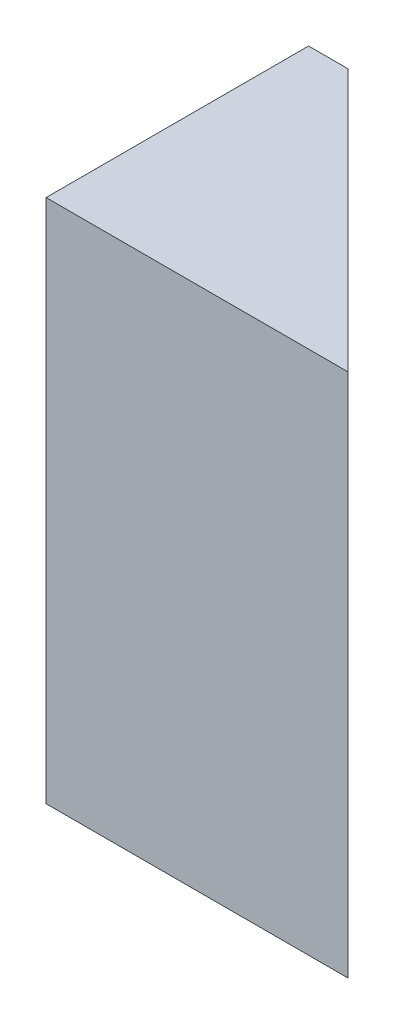
ISO-10303-21;
HEADER;
FILE_DESCRIPTION(('STEP AP214'),'2;1');
FILE_NAME('part.step','',(''),(''),'','','');
FILE_SCHEMA(('AUTOMOTIVE_DESIGN { 1 0 10303 214 1 1 1 1 }'));
ENDSEC;
DATA;
#1=APPLICATION_CONTEXT('core data for automotive mechanical design processes');
#2=APPLICATION_PROTOCOL_DEFINITION('international standard','automotive_design',2000,#1);
#3=PRODUCT_CONTEXT('',#1,'mechanical');
#4=PRODUCT('Part','Part','',(#3));
#5=PRODUCT_RELATED_PRODUCT_CATEGORY('part','',(#4));
#6=PRODUCT_DEFINITION_FORMATION('','',#4);
#7=PRODUCT_DEFINITION_CONTEXT('part definition',#1,'design');
#8=PRODUCT_DEFINITION('design','',#6,#7);
#9=PRODUCT_DEFINITION_SHAPE('','',#8);
#10=(LENGTH_UNIT() NAMED_UNIT(*) SI_UNIT(.MILLI.,.METRE.));
#11=(NAMED_UNIT(*) PLANE_ANGLE_UNIT() SI_UNIT($,.RADIAN.));
#12=(NAMED_UNIT(*) SI_UNIT($,.STERADIAN.) SOLID_ANGLE_UNIT());
#13=UNCERTAINTY_MEASURE_WITH_UNIT(LENGTH_MEASURE(1.E-05),#10,'distance_accuracy_value','');
#14=(GEOMETRIC_REPRESENTATION_CONTEXT(3) GLOBAL_UNCERTAINTY_ASSIGNED_CONTEXT((#13)) GLOBAL_UNIT_ASSIGNED_CONTEXT((#10,
#11,#12)) REPRESENTATION_CONTEXT('',''));
#15=CARTESIAN_POINT('',(0.,0.,0.));
#16=DIRECTION('',(0.,0.,1.));
#17=DIRECTION('',(1.,0.,0.));
#18=AXIS2_PLACEMENT_3D('',#15,#16,#17);
#19=CARTESIAN_POINT('',(0.,80.,0.));
#20=DIRECTION('',(0.,0.,-1.));
#21=DIRECTION('',(-1.,0.,0.));
#22=AXIS2_PLACEMENT_3D('',#19,#20,#21);
#23=PLANE('',#22);
#24=DIRECTION('',(1.,0.,0.));
#25=VECTOR('',#24,1.);
#26=CARTESIAN_POINT('',(0.,0.,0.));
#27=LINE('',#26,#25);
#28=CARTESIAN_POINT('',(-6.,0.,0.));
#29=VERTEX_POINT('',#28);
#30=CARTESIAN_POINT('',(40.,0.,0.));
#31=VERTEX_POINT('',#30);
#32=EDGE_CURVE('E79',#29,#31,#27,.T.);
#33=ORIENTED_EDGE('',*,*,#32,.T.);
#34=DIRECTION('',(0.,-1.,0.));
#35=VECTOR('',#34,1.);
#36=CARTESIAN_POINT('',(40.,80.,0.));
#37=LINE('',#36,#35);
#38=CARTESIAN_POINT('',(40.,80.,0.));
#39=VERTEX_POINT('',#38);
#40=EDGE_CURVE('E11',#39,#31,#37,.T.);
#41=ORIENTED_EDGE('',*,*,#40,.F.);
#42=DIRECTION('',(1.,0.,0.));
#43=VECTOR('',#42,1.);
#44=CARTESIAN_POINT('',(0.,80.,0.));
#45=LINE('',#44,#43);
#46=CARTESIAN_POINT('',(-6.,80.,0.));
#47=VERTEX_POINT('',#46);
#48=EDGE_CURVE('E84',#47,#39,#45,.T.);
#49=ORIENTED_EDGE('',*,*,#48,.F.);
#50=DIRECTION('',(0.,-1.,0.));
#51=VECTOR('',#50,1.);
#52=CARTESIAN_POINT('',(-6.,80.,0.));
#53=LINE('',#52,#51);
#54=EDGE_CURVE('E99',#47,#29,#53,.T.);
#55=ORIENTED_EDGE('',*,*,#54,.T.);
#56=EDGE_LOOP('',(#33,#41,#49,#55));
#57=FACE_BOUND('',#56,.T.);
#58=ADVANCED_FACE('F39',(#57),#23,.F.);
#59=CARTESIAN_POINT('',(0.,80.,-40.));
#60=DIRECTION('',(-0.707106781186548,0.,0.707106781186548));
#61=DIRECTION('',(0.707106781186548,0.,0.707106781186548));
#62=AXIS2_PLACEMENT_3D('',#59,#60,#61);
#63=PLANE('',#62);
#64=DIRECTION('',(-0.707106781186548,0.,-0.707106781186548));
#65=VECTOR('',#64,1.);
#66=CARTESIAN_POINT('',(0.,0.,-40.));
#67=LINE('',#66,#65);
#68=CARTESIAN_POINT('',(0.,0.,-40.));
#69=VERTEX_POINT('',#68);
#70=EDGE_CURVE('E95',#31,#69,#67,.T.);
#71=ORIENTED_EDGE('',*,*,#70,.T.);
#72=DIRECTION('',(0.,-1.,0.));
#73=VECTOR('',#72,1.);
#74=CARTESIAN_POINT('',(0.,80.,-40.));
#75=LINE('',#74,#73);
#76=CARTESIAN_POINT('',(0.,80.,-40.));
#77=VERTEX_POINT('',#76);
#78=EDGE_CURVE('E47',#77,#69,#75,.T.);
#79=ORIENTED_EDGE('',*,*,#78,.F.);
#80=DIRECTION('',(-0.707106781186548,0.,-0.707106781186548));
#81=VECTOR('',#80,1.);
#82=CARTESIAN_POINT('',(0.,80.,-40.));
#83=LINE('',#82,#81);
#84=EDGE_CURVE('E87',#39,#77,#83,.T.);
#85=ORIENTED_EDGE('',*,*,#84,.F.);
#86=ORIENTED_EDGE('',*,*,#40,.T.);
#87=EDGE_LOOP('',(#71,#79,#85,#86));
#88=FACE_BOUND('',#87,.T.);
#89=ADVANCED_FACE('F94',(#88),#63,.F.);
#90=CARTESIAN_POINT('',(-6.,80.,-40.));
#91=DIRECTION('',(0.,0.,1.));
#92=DIRECTION('',(1.,0.,0.));
#93=AXIS2_PLACEMENT_3D('',#90,#91,#92);
#94=PLANE('',#93);
#95=DIRECTION('',(-1.,0.,0.));
#96=VECTOR('',#95,1.);
#97=CARTESIAN_POINT('',(-6.,0.,-40.));
#98=LINE('',#97,#96);
#99=CARTESIAN_POINT('',(-6.,0.,-40.));
#100=VERTEX_POINT('',#99);
#101=EDGE_CURVE('E72',#69,#100,#98,.T.);
#102=ORIENTED_EDGE('',*,*,#101,.T.);
#103=DIRECTION('',(0.,-1.,0.));
#104=VECTOR('',#103,1.);
#105=CARTESIAN_POINT('',(-6.,80.,-40.));
#106=LINE('',#105,#104);
#107=CARTESIAN_POINT('',(-6.,80.,-40.));
#108=VERTEX_POINT('',#107);
#109=EDGE_CURVE('E96',#108,#100,#106,.T.);
#110=ORIENTED_EDGE('',*,*,#109,.F.);
#111=DIRECTION('',(-1.,0.,0.));
#112=VECTOR('',#111,1.);
#113=CARTESIAN_POINT('',(-6.,80.,-40.));
#114=LINE('',#113,#112);
#115=EDGE_CURVE('E91',#77,#108,#114,.T.);
#116=ORIENTED_EDGE('',*,*,#115,.F.);
#117=ORIENTED_EDGE('',*,*,#78,.T.);
#118=EDGE_LOOP('',(#102,#110,#116,#117));
#119=FACE_BOUND('',#118,.T.);
#120=ADVANCED_FACE('F97',(#119),#94,.F.);
#121=CARTESIAN_POINT('',(-6.,80.,0.));
#122=DIRECTION('',(1.,0.,0.));
#123=DIRECTION('',(0.,0.,-1.));
#124=AXIS2_PLACEMENT_3D('',#121,#122,#123);
#125=PLANE('',#124);
#126=DIRECTION('',(0.,0.,1.));
#127=VECTOR('',#126,1.);
#128=CARTESIAN_POINT('',(-6.,0.,0.));
#129=LINE('',#128,#127);
#130=EDGE_CURVE('E106',#100,#29,#129,.T.);
#131=ORIENTED_EDGE('',*,*,#130,.T.);
#132=ORIENTED_EDGE('',*,*,#54,.F.);
#133=DIRECTION('',(0.,0.,1.));
#134=VECTOR('',#133,1.);
#135=CARTESIAN_POINT('',(-6.,80.,0.));
#136=LINE('',#135,#134);
#137=EDGE_CURVE('E55',#108,#47,#136,.T.);
#138=ORIENTED_EDGE('',*,*,#137,.F.);
#139=ORIENTED_EDGE('',*,*,#109,.T.);
#140=EDGE_LOOP('',(#131,#132,#138,#139));
#141=FACE_BOUND('',#140,.T.);
#142=ADVANCED_FACE('F111',(#141),#125,.F.);
#143=CARTESIAN_POINT('',(0.,80.,0.));
#144=DIRECTION('',(0.,-1.,0.));
#145=DIRECTION('',(0.,0.,-1.));
#146=AXIS2_PLACEMENT_3D('',#143,#144,#145);
#147=PLANE('',#146);
#148=ORIENTED_EDGE('',*,*,#48,.T.);
#149=ORIENTED_EDGE('',*,*,#84,.T.);
#150=ORIENTED_EDGE('',*,*,#115,.T.);
#151=ORIENTED_EDGE('',*,*,#137,.T.);
#152=EDGE_LOOP('',(#148,#149,#150,#151));
#153=FACE_BOUND('',#152,.T.);
#154=ADVANCED_FACE('F89',(#153),#147,.F.);
#155=CARTESIAN_POINT('',(0.,0.,0.));
#156=DIRECTION('',(0.,-1.,0.));
#157=DIRECTION('',(0.,0.,-1.));
#158=AXIS2_PLACEMENT_3D('',#155,#156,#157);
#159=PLANE('',#158);
#160=ORIENTED_EDGE('',*,*,#32,.F.);
#161=ORIENTED_EDGE('',*,*,#130,.F.);
#162=ORIENTED_EDGE('',*,*,#101,.F.);
#163=ORIENTED_EDGE('',*,*,#70,.F.);
#164=EDGE_LOOP('',(#160,#161,#162,#163));
#165=FACE_BOUND('',#164,.T.);
#166=ADVANCED_FACE('F112',(#165),#159,.T.);
#167=CLOSED_SHELL('',(#58,#89,#120,#142,#154,#166));
#168=MANIFOLD_SOLID_BREP('B2',#167);
#169=ADVANCED_BREP_SHAPE_REPRESENTATION('',(#18,#168),#14);
#170=SHAPE_DEFINITION_REPRESENTATION(#9,#169);
ENDSEC;
END-ISO-10303-21;
